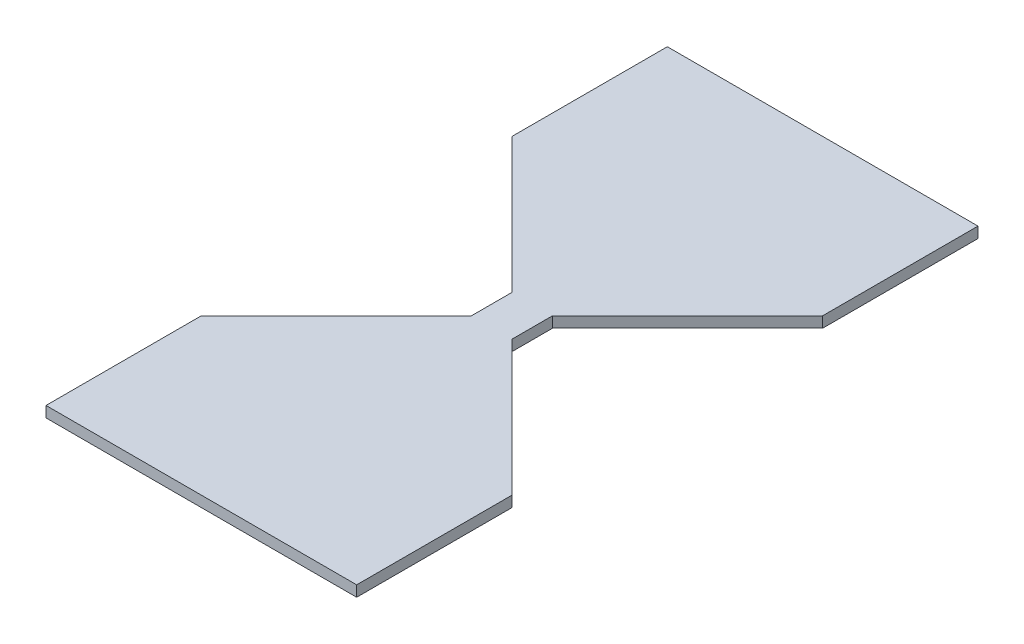
ISO-10303-21;
HEADER;
FILE_DESCRIPTION(('STEP AP214'),'2;1');
FILE_NAME('part.step','',(''),(''),'','','');
FILE_SCHEMA(('AUTOMOTIVE_DESIGN { 1 0 10303 214 1 1 1 1 }'));
ENDSEC;
DATA;
#1=APPLICATION_CONTEXT('core data for automotive mechanical design processes');
#2=APPLICATION_PROTOCOL_DEFINITION('international standard','automotive_design',2000,#1);
#3=PRODUCT_CONTEXT('',#1,'mechanical');
#4=PRODUCT('Part','Part','',(#3));
#5=PRODUCT_RELATED_PRODUCT_CATEGORY('part','',(#4));
#6=PRODUCT_DEFINITION_FORMATION('','',#4);
#7=PRODUCT_DEFINITION_CONTEXT('part definition',#1,'design');
#8=PRODUCT_DEFINITION('design','',#6,#7);
#9=PRODUCT_DEFINITION_SHAPE('','',#8);
#10=(LENGTH_UNIT() NAMED_UNIT(*) SI_UNIT(.MILLI.,.METRE.));
#11=(NAMED_UNIT(*) PLANE_ANGLE_UNIT() SI_UNIT($,.RADIAN.));
#12=(NAMED_UNIT(*) SI_UNIT($,.STERADIAN.) SOLID_ANGLE_UNIT());
#13=UNCERTAINTY_MEASURE_WITH_UNIT(LENGTH_MEASURE(1.E-05),#10,'distance_accuracy_value','');
#14=(GEOMETRIC_REPRESENTATION_CONTEXT(3) GLOBAL_UNCERTAINTY_ASSIGNED_CONTEXT((#13)) GLOBAL_UNIT_ASSIGNED_CONTEXT((#10,
#11,#12)) REPRESENTATION_CONTEXT('',''));
#15=CARTESIAN_POINT('',(0.,0.,0.));
#16=DIRECTION('',(0.,0.,1.));
#17=DIRECTION('',(1.,0.,0.));
#18=AXIS2_PLACEMENT_3D('',#15,#16,#17);
#19=CARTESIAN_POINT('',(0.,1.6,-23.));
#20=DIRECTION('',(1.,0.,0.));
#21=DIRECTION('',(0.,0.,-1.));
#22=AXIS2_PLACEMENT_3D('',#19,#20,#21);
#23=PLANE('',#22);
#24=DIRECTION('',(0.,0.,1.));
#25=VECTOR('',#24,1.);
#26=CARTESIAN_POINT('',(0.,0.,-23.));
#27=LINE('',#26,#25);
#28=CARTESIAN_POINT('',(0.,0.,-23.));
#29=VERTEX_POINT('',#28);
#30=CARTESIAN_POINT('',(0.,0.,0.));
#31=VERTEX_POINT('',#30);
#32=EDGE_CURVE('E164',#29,#31,#27,.T.);
#33=ORIENTED_EDGE('',*,*,#32,.T.);
#34=DIRECTION('',(0.,-1.,0.));
#35=VECTOR('',#34,1.);
#36=CARTESIAN_POINT('',(0.,1.6,0.));
#37=LINE('',#36,#35);
#38=CARTESIAN_POINT('',(0.,1.6,0.));
#39=VERTEX_POINT('',#38);
#40=EDGE_CURVE('E11',#39,#31,#37,.T.);
#41=ORIENTED_EDGE('',*,*,#40,.F.);
#42=DIRECTION('',(0.,0.,1.));
#43=VECTOR('',#42,1.);
#44=CARTESIAN_POINT('',(0.,1.6,-23.));
#45=LINE('',#44,#43);
#46=CARTESIAN_POINT('',(0.,1.6,-23.));
#47=VERTEX_POINT('',#46);
#48=EDGE_CURVE('E198',#47,#39,#45,.T.);
#49=ORIENTED_EDGE('',*,*,#48,.F.);
#50=DIRECTION('',(0.,-1.,0.));
#51=VECTOR('',#50,1.);
#52=CARTESIAN_POINT('',(0.,1.6,-23.));
#53=LINE('',#52,#51);
#54=EDGE_CURVE('E160',#47,#29,#53,.T.);
#55=ORIENTED_EDGE('',*,*,#54,.T.);
#56=EDGE_LOOP('',(#33,#41,#49,#55));
#57=FACE_BOUND('',#56,.T.);
#58=ADVANCED_FACE('F39',(#57),#23,.F.);
#59=CARTESIAN_POINT('',(0.,1.6,0.));
#60=DIRECTION('',(0.,0.,-1.));
#61=DIRECTION('',(-1.,0.,0.));
#62=AXIS2_PLACEMENT_3D('',#59,#60,#61);
#63=PLANE('',#62);
#64=DIRECTION('',(1.,0.,0.));
#65=VECTOR('',#64,1.);
#66=CARTESIAN_POINT('',(0.,0.,0.));
#67=LINE('',#66,#65);
#68=CARTESIAN_POINT('',(46.,0.,0.));
#69=VERTEX_POINT('',#68);
#70=EDGE_CURVE('E168',#31,#69,#67,.T.);
#71=ORIENTED_EDGE('',*,*,#70,.T.);
#72=DIRECTION('',(0.,-1.,0.));
#73=VECTOR('',#72,1.);
#74=CARTESIAN_POINT('',(46.,1.6,0.));
#75=LINE('',#74,#73);
#76=CARTESIAN_POINT('',(46.,1.6,0.));
#77=VERTEX_POINT('',#76);
#78=EDGE_CURVE('E48',#77,#69,#75,.T.);
#79=ORIENTED_EDGE('',*,*,#78,.F.);
#80=DIRECTION('',(1.,0.,0.));
#81=VECTOR('',#80,1.);
#82=CARTESIAN_POINT('',(0.,1.6,0.));
#83=LINE('',#82,#81);
#84=EDGE_CURVE('E111',#39,#77,#83,.T.);
#85=ORIENTED_EDGE('',*,*,#84,.F.);
#86=ORIENTED_EDGE('',*,*,#40,.T.);
#87=EDGE_LOOP('',(#71,#79,#85,#86));
#88=FACE_BOUND('',#87,.T.);
#89=ADVANCED_FACE('F292',(#88),#63,.F.);
#90=CARTESIAN_POINT('',(46.,1.6,0.));
#91=DIRECTION('',(-1.,0.,0.));
#92=DIRECTION('',(0.,0.,1.));
#93=AXIS2_PLACEMENT_3D('',#90,#91,#92);
#94=PLANE('',#93);
#95=DIRECTION('',(0.,0.,-1.));
#96=VECTOR('',#95,1.);
#97=CARTESIAN_POINT('',(46.,0.,0.));
#98=LINE('',#97,#96);
#99=CARTESIAN_POINT('',(46.,0.,-23.));
#100=VERTEX_POINT('',#99);
#101=EDGE_CURVE('E171',#69,#100,#98,.T.);
#102=ORIENTED_EDGE('',*,*,#101,.T.);
#103=DIRECTION('',(0.,-1.,0.));
#104=VECTOR('',#103,1.);
#105=CARTESIAN_POINT('',(46.,1.6,-23.));
#106=LINE('',#105,#104);
#107=CARTESIAN_POINT('',(46.,1.6,-23.));
#108=VERTEX_POINT('',#107);
#109=EDGE_CURVE('E225',#108,#100,#106,.T.);
#110=ORIENTED_EDGE('',*,*,#109,.F.);
#111=DIRECTION('',(0.,0.,-1.));
#112=VECTOR('',#111,1.);
#113=CARTESIAN_POINT('',(46.,1.6,0.));
#114=LINE('',#113,#112);
#115=EDGE_CURVE('E235',#77,#108,#114,.T.);
#116=ORIENTED_EDGE('',*,*,#115,.F.);
#117=ORIENTED_EDGE('',*,*,#78,.T.);
#118=EDGE_LOOP('',(#102,#110,#116,#117));
#119=FACE_BOUND('',#118,.T.);
#120=ADVANCED_FACE('F233',(#119),#94,.F.);
#121=CARTESIAN_POINT('',(46.,1.6,-23.));
#122=DIRECTION('',(-0.707106781186548,0.,0.707106781186548));
#123=DIRECTION('',(0.707106781186548,0.,0.707106781186548));
#124=AXIS2_PLACEMENT_3D('',#121,#122,#123);
#125=PLANE('',#124);
#126=DIRECTION('',(-0.707106781186547,0.,-0.707106781186547));
#127=VECTOR('',#126,1.);
#128=CARTESIAN_POINT('',(46.,0.,-23.));
#129=LINE('',#128,#127);
#130=CARTESIAN_POINT('',(26.0001918009197,0.,-42.9998081990803));
#131=VERTEX_POINT('',#130);
#132=EDGE_CURVE('E174',#100,#131,#129,.T.);
#133=ORIENTED_EDGE('',*,*,#132,.T.);
#134=DIRECTION('',(0.,-1.,0.));
#135=VECTOR('',#134,1.);
#136=CARTESIAN_POINT('',(26.0001918009197,1.6,-42.9998081990803));
#137=LINE('',#136,#135);
#138=CARTESIAN_POINT('',(26.0001918009197,1.6,-42.9998081990803));
#139=VERTEX_POINT('',#138);
#140=EDGE_CURVE('E221',#139,#131,#137,.T.);
#141=ORIENTED_EDGE('',*,*,#140,.F.);
#142=DIRECTION('',(-0.707106781186547,0.,-0.707106781186547));
#143=VECTOR('',#142,1.);
#144=CARTESIAN_POINT('',(46.,1.6,-23.));
#145=LINE('',#144,#143);
#146=EDGE_CURVE('E254',#108,#139,#145,.T.);
#147=ORIENTED_EDGE('',*,*,#146,.F.);
#148=ORIENTED_EDGE('',*,*,#109,.T.);
#149=EDGE_LOOP('',(#133,#141,#147,#148));
#150=FACE_BOUND('',#149,.T.);
#151=ADVANCED_FACE('F244',(#150),#125,.F.);
#152=CARTESIAN_POINT('',(26.0001918009197,1.6,-42.9998081990803));
#153=DIRECTION('',(-1.,0.,0.));
#154=DIRECTION('',(0.,0.,1.));
#155=AXIS2_PLACEMENT_3D('',#152,#153,#154);
#156=PLANE('',#155);
#157=DIRECTION('',(0.,0.,-1.));
#158=VECTOR('',#157,1.);
#159=CARTESIAN_POINT('',(26.0001918009197,0.,-42.9998081990803));
#160=LINE('',#159,#158);
#161=CARTESIAN_POINT('',(26.0001918009197,0.,-48.9998081990804));
#162=VERTEX_POINT('',#161);
#163=EDGE_CURVE('E177',#131,#162,#160,.T.);
#164=ORIENTED_EDGE('',*,*,#163,.T.);
#165=DIRECTION('',(0.,-1.,0.));
#166=VECTOR('',#165,1.);
#167=CARTESIAN_POINT('',(26.0001918009197,1.6,-48.9998081990804));
#168=LINE('',#167,#166);
#169=CARTESIAN_POINT('',(26.0001918009197,1.6,-48.9998081990804));
#170=VERTEX_POINT('',#169);
#171=EDGE_CURVE('E217',#170,#162,#168,.T.);
#172=ORIENTED_EDGE('',*,*,#171,.F.);
#173=DIRECTION('',(0.,0.,-1.));
#174=VECTOR('',#173,1.);
#175=CARTESIAN_POINT('',(26.0001918009197,1.6,-42.9998081990803));
#176=LINE('',#175,#174);
#177=EDGE_CURVE('E250',#139,#170,#176,.T.);
#178=ORIENTED_EDGE('',*,*,#177,.F.);
#179=ORIENTED_EDGE('',*,*,#140,.T.);
#180=EDGE_LOOP('',(#164,#172,#178,#179));
#181=FACE_BOUND('',#180,.T.);
#182=ADVANCED_FACE('F248',(#181),#156,.F.);
#183=CARTESIAN_POINT('',(26.0001918009197,1.6,-48.9998081990804));
#184=DIRECTION('',(-0.707106781186548,0.,-0.707106781186548));
#185=DIRECTION('',(-0.707106781186548,0.,0.707106781186548));
#186=AXIS2_PLACEMENT_3D('',#183,#184,#185);
#187=PLANE('',#186);
#188=DIRECTION('',(0.707106781186548,0.,-0.707106781186548));
#189=VECTOR('',#188,1.);
#190=CARTESIAN_POINT('',(26.0001918009197,0.,-48.9998081990804));
#191=LINE('',#190,#189);
#192=CARTESIAN_POINT('',(46.,0.,-68.9996163981607));
#193=VERTEX_POINT('',#192);
#194=EDGE_CURVE('E180',#162,#193,#191,.T.);
#195=ORIENTED_EDGE('',*,*,#194,.T.);
#196=DIRECTION('',(0.,-1.,0.));
#197=VECTOR('',#196,1.);
#198=CARTESIAN_POINT('',(46.,1.6,-68.9996163981607));
#199=LINE('',#198,#197);
#200=CARTESIAN_POINT('',(46.,1.6,-68.9996163981607));
#201=VERTEX_POINT('',#200);
#202=EDGE_CURVE('E213',#201,#193,#199,.T.);
#203=ORIENTED_EDGE('',*,*,#202,.F.);
#204=DIRECTION('',(0.707106781186548,0.,-0.707106781186548));
#205=VECTOR('',#204,1.);
#206=CARTESIAN_POINT('',(26.0001918009197,1.6,-48.9998081990804));
#207=LINE('',#206,#205);
#208=EDGE_CURVE('E253',#170,#201,#207,.T.);
#209=ORIENTED_EDGE('',*,*,#208,.F.);
#210=ORIENTED_EDGE('',*,*,#171,.T.);
#211=EDGE_LOOP('',(#195,#203,#209,#210));
#212=FACE_BOUND('',#211,.T.);
#213=ADVANCED_FACE('F305',(#212),#187,.F.);
#214=CARTESIAN_POINT('',(46.,1.6,-68.9996163981607));
#215=DIRECTION('',(-1.,0.,0.));
#216=DIRECTION('',(0.,0.,1.));
#217=AXIS2_PLACEMENT_3D('',#214,#215,#216);
#218=PLANE('',#217);
#219=DIRECTION('',(0.,0.,-1.));
#220=VECTOR('',#219,1.);
#221=CARTESIAN_POINT('',(46.,0.,-68.9996163981607));
#222=LINE('',#221,#220);
#223=CARTESIAN_POINT('',(46.,0.,-91.9996163981607));
#224=VERTEX_POINT('',#223);
#225=EDGE_CURVE('E183',#193,#224,#222,.T.);
#226=ORIENTED_EDGE('',*,*,#225,.T.);
#227=DIRECTION('',(0.,-1.,0.));
#228=VECTOR('',#227,1.);
#229=CARTESIAN_POINT('',(46.,1.6,-91.9996163981607));
#230=LINE('',#229,#228);
#231=CARTESIAN_POINT('',(46.,1.6,-91.9996163981607));
#232=VERTEX_POINT('',#231);
#233=EDGE_CURVE('E209',#232,#224,#230,.T.);
#234=ORIENTED_EDGE('',*,*,#233,.F.);
#235=DIRECTION('',(0.,0.,-1.));
#236=VECTOR('',#235,1.);
#237=CARTESIAN_POINT('',(46.,1.6,-68.9996163981607));
#238=LINE('',#237,#236);
#239=EDGE_CURVE('E258',#201,#232,#238,.T.);
#240=ORIENTED_EDGE('',*,*,#239,.F.);
#241=ORIENTED_EDGE('',*,*,#202,.T.);
#242=EDGE_LOOP('',(#226,#234,#240,#241));
#243=FACE_BOUND('',#242,.T.);
#244=ADVANCED_FACE('F308',(#243),#218,.F.);
#245=CARTESIAN_POINT('',(0.,1.6,-91.9996163981609));
#246=DIRECTION('',(0.,0.,1.));
#247=DIRECTION('',(1.,0.,0.));
#248=AXIS2_PLACEMENT_3D('',#245,#246,#247);
#249=PLANE('',#248);
#250=DIRECTION('',(-1.,0.,0.));
#251=VECTOR('',#250,1.);
#252=CARTESIAN_POINT('',(0.,0.,-91.9996163981609));
#253=LINE('',#252,#251);
#254=CARTESIAN_POINT('',(0.,0.,-91.9996163981609));
#255=VERTEX_POINT('',#254);
#256=EDGE_CURVE('E186',#224,#255,#253,.T.);
#257=ORIENTED_EDGE('',*,*,#256,.T.);
#258=DIRECTION('',(0.,-1.,0.));
#259=VECTOR('',#258,1.);
#260=CARTESIAN_POINT('',(0.,1.6,-91.9996163981609));
#261=LINE('',#260,#259);
#262=CARTESIAN_POINT('',(0.,1.6,-91.9996163981609));
#263=VERTEX_POINT('',#262);
#264=EDGE_CURVE('E205',#263,#255,#261,.T.);
#265=ORIENTED_EDGE('',*,*,#264,.F.);
#266=DIRECTION('',(-1.,0.,0.));
#267=VECTOR('',#266,1.);
#268=CARTESIAN_POINT('',(0.,1.6,-91.9996163981609));
#269=LINE('',#268,#267);
#270=EDGE_CURVE('E265',#232,#263,#269,.T.);
#271=ORIENTED_EDGE('',*,*,#270,.F.);
#272=ORIENTED_EDGE('',*,*,#233,.T.);
#273=EDGE_LOOP('',(#257,#265,#271,#272));
#274=FACE_BOUND('',#273,.T.);
#275=ADVANCED_FACE('F273',(#274),#249,.F.);
#276=CARTESIAN_POINT('',(0.,1.6,-68.9996163981608));
#277=DIRECTION('',(1.,0.,0.));
#278=DIRECTION('',(0.,0.,-1.));
#279=AXIS2_PLACEMENT_3D('',#276,#277,#278);
#280=PLANE('',#279);
#281=DIRECTION('',(0.,0.,1.));
#282=VECTOR('',#281,1.);
#283=CARTESIAN_POINT('',(0.,0.,-68.9996163981608));
#284=LINE('',#283,#282);
#285=CARTESIAN_POINT('',(0.,0.,-68.9996163981608));
#286=VERTEX_POINT('',#285);
#287=EDGE_CURVE('E189',#255,#286,#284,.T.);
#288=ORIENTED_EDGE('',*,*,#287,.T.);
#289=DIRECTION('',(0.,-1.,0.));
#290=VECTOR('',#289,1.);
#291=CARTESIAN_POINT('',(0.,1.6,-68.9996163981608));
#292=LINE('',#291,#290);
#293=CARTESIAN_POINT('',(0.,1.6,-68.9996163981608));
#294=VERTEX_POINT('',#293);
#295=EDGE_CURVE('E153',#294,#286,#292,.T.);
#296=ORIENTED_EDGE('',*,*,#295,.F.);
#297=DIRECTION('',(0.,0.,1.));
#298=VECTOR('',#297,1.);
#299=CARTESIAN_POINT('',(0.,1.6,-68.9996163981608));
#300=LINE('',#299,#298);
#301=EDGE_CURVE('E142',#263,#294,#300,.T.);
#302=ORIENTED_EDGE('',*,*,#301,.F.);
#303=ORIENTED_EDGE('',*,*,#264,.T.);
#304=EDGE_LOOP('',(#288,#296,#302,#303));
#305=FACE_BOUND('',#304,.T.);
#306=ADVANCED_FACE('F277',(#305),#280,.F.);
#307=CARTESIAN_POINT('',(19.9998081990804,1.6,-48.9998081990804));
#308=DIRECTION('',(0.707106781186548,0.,-0.707106781186547));
#309=DIRECTION('',(-0.707106781186547,0.,-0.707106781186548));
#310=AXIS2_PLACEMENT_3D('',#307,#308,#309);
#311=PLANE('',#310);
#312=DIRECTION('',(0.707106781186547,0.,0.707106781186548));
#313=VECTOR('',#312,1.);
#314=CARTESIAN_POINT('',(19.9998081990804,0.,-48.9998081990804));
#315=LINE('',#314,#313);
#316=CARTESIAN_POINT('',(19.9998081990804,0.,-48.9998081990804));
#317=VERTEX_POINT('',#316);
#318=EDGE_CURVE('E151',#286,#317,#315,.T.);
#319=ORIENTED_EDGE('',*,*,#318,.T.);
#320=DIRECTION('',(0.,-1.,0.));
#321=VECTOR('',#320,1.);
#322=CARTESIAN_POINT('',(19.9998081990804,1.6,-48.9998081990804));
#323=LINE('',#322,#321);
#324=CARTESIAN_POINT('',(19.9998081990804,1.6,-48.9998081990804));
#325=VERTEX_POINT('',#324);
#326=EDGE_CURVE('E148',#325,#317,#323,.T.);
#327=ORIENTED_EDGE('',*,*,#326,.F.);
#328=DIRECTION('',(0.707106781186547,0.,0.707106781186548));
#329=VECTOR('',#328,1.);
#330=CARTESIAN_POINT('',(19.9998081990804,1.6,-48.9998081990804));
#331=LINE('',#330,#329);
#332=EDGE_CURVE('E136',#294,#325,#331,.T.);
#333=ORIENTED_EDGE('',*,*,#332,.F.);
#334=ORIENTED_EDGE('',*,*,#295,.T.);
#335=EDGE_LOOP('',(#319,#327,#333,#334));
#336=FACE_BOUND('',#335,.T.);
#337=ADVANCED_FACE('F149',(#336),#311,.F.);
#338=CARTESIAN_POINT('',(19.9998081990804,1.6,-42.9998081990802));
#339=DIRECTION('',(1.,0.,0.));
#340=DIRECTION('',(0.,0.,-1.));
#341=AXIS2_PLACEMENT_3D('',#338,#339,#340);
#342=PLANE('',#341);
#343=DIRECTION('',(0.,0.,1.));
#344=VECTOR('',#343,1.);
#345=CARTESIAN_POINT('',(19.9998081990804,0.,-42.9998081990802));
#346=LINE('',#345,#344);
#347=CARTESIAN_POINT('',(19.9998081990804,0.,-42.9998081990802));
#348=VERTEX_POINT('',#347);
#349=EDGE_CURVE('E97',#317,#348,#346,.T.);
#350=ORIENTED_EDGE('',*,*,#349,.T.);
#351=DIRECTION('',(0.,-1.,0.));
#352=VECTOR('',#351,1.);
#353=CARTESIAN_POINT('',(19.9998081990804,1.6,-42.9998081990802));
#354=LINE('',#353,#352);
#355=CARTESIAN_POINT('',(19.9998081990804,1.6,-42.9998081990802));
#356=VERTEX_POINT('',#355);
#357=EDGE_CURVE('E154',#356,#348,#354,.T.);
#358=ORIENTED_EDGE('',*,*,#357,.F.);
#359=DIRECTION('',(0.,0.,1.));
#360=VECTOR('',#359,1.);
#361=CARTESIAN_POINT('',(19.9998081990804,1.6,-42.9998081990802));
#362=LINE('',#361,#360);
#363=EDGE_CURVE('E140',#325,#356,#362,.T.);
#364=ORIENTED_EDGE('',*,*,#363,.F.);
#365=ORIENTED_EDGE('',*,*,#326,.T.);
#366=EDGE_LOOP('',(#350,#358,#364,#365));
#367=FACE_BOUND('',#366,.T.);
#368=ADVANCED_FACE('F156',(#367),#342,.F.);
#369=CARTESIAN_POINT('',(19.9998081990804,1.6,-42.9998081990802));
#370=DIRECTION('',(0.707106781186544,0.,0.707106781186551));
#371=DIRECTION('',(0.707106781186551,0.,-0.707106781186544));
#372=AXIS2_PLACEMENT_3D('',#369,#370,#371);
#373=PLANE('',#372);
#374=DIRECTION('',(-0.707106781186551,0.,0.707106781186544));
#375=VECTOR('',#374,1.);
#376=CARTESIAN_POINT('',(19.9998081990804,0.,-42.9998081990802));
#377=LINE('',#376,#375);
#378=EDGE_CURVE('E103',#348,#29,#377,.T.);
#379=ORIENTED_EDGE('',*,*,#378,.T.);
#380=ORIENTED_EDGE('',*,*,#54,.F.);
#381=DIRECTION('',(-0.707106781186551,0.,0.707106781186544));
#382=VECTOR('',#381,1.);
#383=CARTESIAN_POINT('',(19.9998081990804,1.6,-42.9998081990802));
#384=LINE('',#383,#382);
#385=EDGE_CURVE('E56',#356,#47,#384,.T.);
#386=ORIENTED_EDGE('',*,*,#385,.F.);
#387=ORIENTED_EDGE('',*,*,#357,.T.);
#388=EDGE_LOOP('',(#379,#380,#386,#387));
#389=FACE_BOUND('',#388,.T.);
#390=ADVANCED_FACE('F281',(#389),#373,.F.);
#391=CARTESIAN_POINT('',(0.,1.6,0.));
#392=DIRECTION('',(0.,1.,0.));
#393=DIRECTION('',(0.,0.,1.));
#394=AXIS2_PLACEMENT_3D('',#391,#392,#393);
#395=PLANE('',#394);
#396=ORIENTED_EDGE('',*,*,#48,.T.);
#397=ORIENTED_EDGE('',*,*,#84,.T.);
#398=ORIENTED_EDGE('',*,*,#115,.T.);
#399=ORIENTED_EDGE('',*,*,#146,.T.);
#400=ORIENTED_EDGE('',*,*,#177,.T.);
#401=ORIENTED_EDGE('',*,*,#208,.T.);
#402=ORIENTED_EDGE('',*,*,#239,.T.);
#403=ORIENTED_EDGE('',*,*,#270,.T.);
#404=ORIENTED_EDGE('',*,*,#301,.T.);
#405=ORIENTED_EDGE('',*,*,#332,.T.);
#406=ORIENTED_EDGE('',*,*,#363,.T.);
#407=ORIENTED_EDGE('',*,*,#385,.T.);
#408=EDGE_LOOP('',(#396,#397,#398,#399,#400,#401,#402,#403,#404,#405,#406,#407));
#409=FACE_BOUND('',#408,.T.);
#410=ADVANCED_FACE('F138',(#409),#395,.T.);
#411=CARTESIAN_POINT('',(0.,0.,0.));
#412=DIRECTION('',(0.,1.,0.));
#413=DIRECTION('',(0.,0.,1.));
#414=AXIS2_PLACEMENT_3D('',#411,#412,#413);
#415=PLANE('',#414);
#416=ORIENTED_EDGE('',*,*,#32,.F.);
#417=ORIENTED_EDGE('',*,*,#378,.F.);
#418=ORIENTED_EDGE('',*,*,#349,.F.);
#419=ORIENTED_EDGE('',*,*,#318,.F.);
#420=ORIENTED_EDGE('',*,*,#287,.F.);
#421=ORIENTED_EDGE('',*,*,#256,.F.);
#422=ORIENTED_EDGE('',*,*,#225,.F.);
#423=ORIENTED_EDGE('',*,*,#194,.F.);
#424=ORIENTED_EDGE('',*,*,#163,.F.);
#425=ORIENTED_EDGE('',*,*,#132,.F.);
#426=ORIENTED_EDGE('',*,*,#101,.F.);
#427=ORIENTED_EDGE('',*,*,#70,.F.);
#428=EDGE_LOOP('',(#416,#417,#418,#419,#420,#421,#422,#423,#424,#425,#426,#427));
#429=FACE_BOUND('',#428,.T.);
#430=ADVANCED_FACE('F239',(#429),#415,.F.);
#431=CLOSED_SHELL('',(#58,#89,#120,#151,#182,#213,#244,#275,#306,#337,#368,#390,#410,#430));
#432=MANIFOLD_SOLID_BREP('B2',#431);
#433=ADVANCED_BREP_SHAPE_REPRESENTATION('',(#18,#432),#14);
#434=SHAPE_DEFINITION_REPRESENTATION(#9,#433);
ENDSEC;
END-ISO-10303-21;
